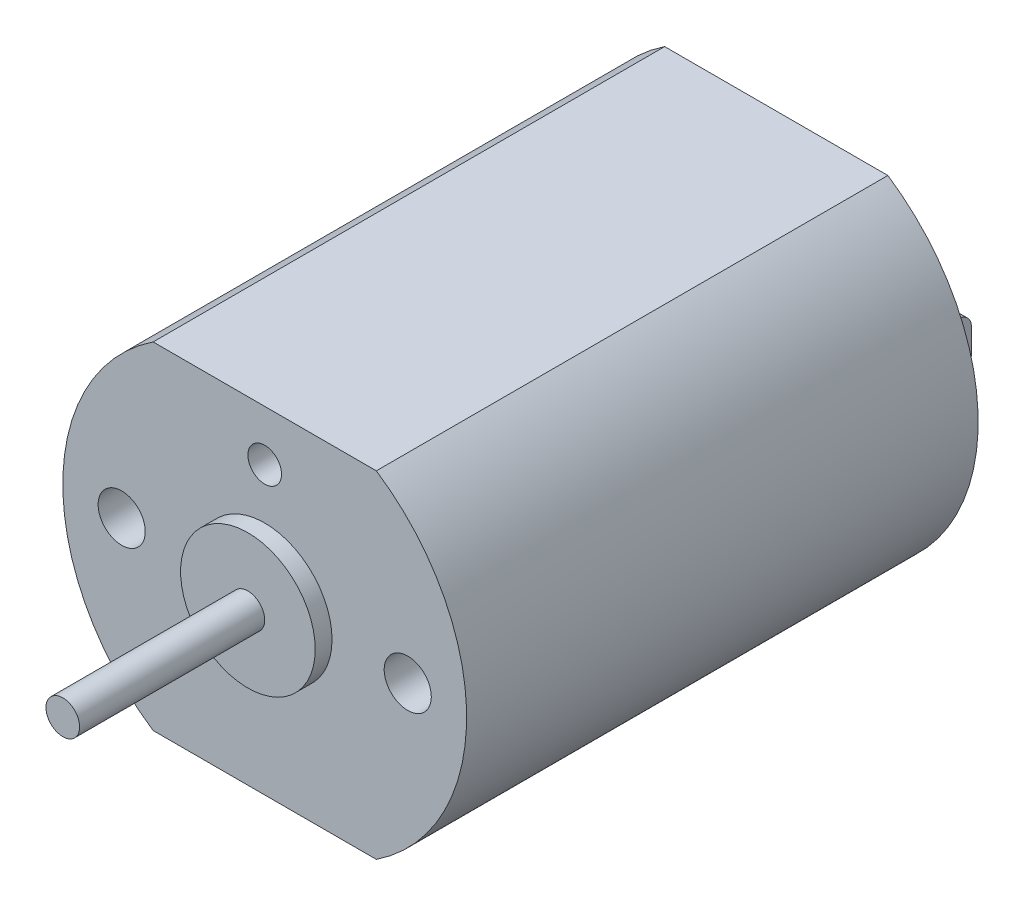
ISO-10303-21;
HEADER;
FILE_DESCRIPTION(('STEP AP214'),'2;1');
FILE_NAME('part.step','',(''),(''),'','','');
FILE_SCHEMA(('AUTOMOTIVE_DESIGN { 1 0 10303 214 1 1 1 1 }'));
ENDSEC;
DATA;
#1=APPLICATION_CONTEXT('core data for automotive mechanical design processes');
#2=APPLICATION_PROTOCOL_DEFINITION('international standard','automotive_design',2000,#1);
#3=PRODUCT_CONTEXT('',#1,'mechanical');
#4=PRODUCT('Part','Part','',(#3));
#5=PRODUCT_RELATED_PRODUCT_CATEGORY('part','',(#4));
#6=PRODUCT_DEFINITION_FORMATION('','',#4);
#7=PRODUCT_DEFINITION_CONTEXT('part definition',#1,'design');
#8=PRODUCT_DEFINITION('design','',#6,#7);
#9=PRODUCT_DEFINITION_SHAPE('','',#8);
#10=(LENGTH_UNIT() NAMED_UNIT(*) SI_UNIT(.MILLI.,.METRE.));
#11=(NAMED_UNIT(*) PLANE_ANGLE_UNIT() SI_UNIT($,.RADIAN.));
#12=(NAMED_UNIT(*) SI_UNIT($,.STERADIAN.) SOLID_ANGLE_UNIT());
#13=UNCERTAINTY_MEASURE_WITH_UNIT(LENGTH_MEASURE(1.E-05),#10,'distance_accuracy_value','');
#14=(GEOMETRIC_REPRESENTATION_CONTEXT(3) GLOBAL_UNCERTAINTY_ASSIGNED_CONTEXT((#13)) GLOBAL_UNIT_ASSIGNED_CONTEXT((#10,
#11,#12)) REPRESENTATION_CONTEXT('',''));
#15=CARTESIAN_POINT('',(0.,0.,0.));
#16=DIRECTION('',(0.,0.,1.));
#17=DIRECTION('',(1.,0.,0.));
#18=AXIS2_PLACEMENT_3D('',#15,#16,#17);
#19=CARTESIAN_POINT('',(0.,5.,15.2));
#20=DIRECTION('',(0.,1.,0.));
#21=DIRECTION('',(0.,0.,1.));
#22=AXIS2_PLACEMENT_3D('',#19,#20,#21);
#23=PLANE('',#22);
#24=DIRECTION('',(1.,0.,0.));
#25=VECTOR('',#24,1.);
#26=CARTESIAN_POINT('',(0.,5.,0.));
#27=LINE('',#26,#25);
#28=CARTESIAN_POINT('',(-3.3166247903554,5.,0.));
#29=VERTEX_POINT('',#28);
#30=CARTESIAN_POINT('',(3.3166247903554,5.,0.));
#31=VERTEX_POINT('',#30);
#32=EDGE_CURVE('E310',#29,#31,#27,.T.);
#33=ORIENTED_EDGE('',*,*,#32,.F.);
#34=DIRECTION('',(0.,0.,-1.));
#35=VECTOR('',#34,1.);
#36=CARTESIAN_POINT('',(-3.3166247903554,5.,15.2));
#37=LINE('',#36,#35);
#38=CARTESIAN_POINT('',(-3.3166247903554,5.,15.2));
#39=VERTEX_POINT('',#38);
#40=EDGE_CURVE('E339',#39,#29,#37,.T.);
#41=ORIENTED_EDGE('',*,*,#40,.F.);
#42=DIRECTION('',(1.,0.,0.));
#43=VECTOR('',#42,1.);
#44=CARTESIAN_POINT('',(0.,5.,15.2));
#45=LINE('',#44,#43);
#46=CARTESIAN_POINT('',(3.3166247903554,5.,15.2));
#47=VERTEX_POINT('',#46);
#48=EDGE_CURVE('E316',#39,#47,#45,.T.);
#49=ORIENTED_EDGE('',*,*,#48,.T.);
#50=DIRECTION('',(0.,0.,-1.));
#51=VECTOR('',#50,1.);
#52=CARTESIAN_POINT('',(3.3166247903554,5.,15.2));
#53=LINE('',#52,#51);
#54=EDGE_CURVE('E331',#47,#31,#53,.T.);
#55=ORIENTED_EDGE('',*,*,#54,.T.);
#56=EDGE_LOOP('',(#33,#41,#49,#55));
#57=FACE_BOUND('',#56,.T.);
#58=ADVANCED_FACE('F38',(#57),#23,.T.);
#59=CARTESIAN_POINT('',(0.,0.,15.2));
#60=DIRECTION('',(0.,0.,-1.));
#61=DIRECTION('',(-1.,0.,0.));
#62=AXIS2_PLACEMENT_3D('',#59,#60,#61);
#63=CYLINDRICAL_SURFACE('',#62,6.);
#64=CARTESIAN_POINT('',(0.,0.,0.));
#65=DIRECTION('',(0.,0.,1.));
#66=DIRECTION('',(1.,0.,0.));
#67=AXIS2_PLACEMENT_3D('',#64,#65,#66);
#68=CIRCLE('',#67,6.);
#69=CARTESIAN_POINT('',(-3.3166247903554,-5.,0.));
#70=VERTEX_POINT('',#69);
#71=EDGE_CURVE('E327',#29,#70,#68,.T.);
#72=ORIENTED_EDGE('',*,*,#71,.T.);
#73=DIRECTION('',(0.,0.,-1.));
#74=VECTOR('',#73,1.);
#75=CARTESIAN_POINT('',(-3.3166247903554,-5.,15.2));
#76=LINE('',#75,#74);
#77=CARTESIAN_POINT('',(-3.3166247903554,-5.,15.2));
#78=VERTEX_POINT('',#77);
#79=EDGE_CURVE('E336',#78,#70,#76,.T.);
#80=ORIENTED_EDGE('',*,*,#79,.F.);
#81=CARTESIAN_POINT('',(0.,0.,15.2));
#82=DIRECTION('',(0.,0.,1.));
#83=DIRECTION('',(1.,0.,0.));
#84=AXIS2_PLACEMENT_3D('',#81,#82,#83);
#85=CIRCLE('',#84,6.);
#86=EDGE_CURVE('E319',#39,#78,#85,.T.);
#87=ORIENTED_EDGE('',*,*,#86,.F.);
#88=ORIENTED_EDGE('',*,*,#40,.T.);
#89=EDGE_LOOP('',(#72,#80,#87,#88));
#90=FACE_BOUND('',#89,.T.);
#91=ADVANCED_FACE('F471',(#90),#63,.T.);
#92=CARTESIAN_POINT('',(0.,-5.,15.2));
#93=DIRECTION('',(0.,1.,0.));
#94=DIRECTION('',(0.,0.,1.));
#95=AXIS2_PLACEMENT_3D('',#92,#93,#94);
#96=PLANE('',#95);
#97=DIRECTION('',(1.,0.,0.));
#98=VECTOR('',#97,1.);
#99=CARTESIAN_POINT('',(0.,-5.,0.));
#100=LINE('',#99,#98);
#101=CARTESIAN_POINT('',(3.3166247903554,-5.,0.));
#102=VERTEX_POINT('',#101);
#103=EDGE_CURVE('E329',#70,#102,#100,.T.);
#104=ORIENTED_EDGE('',*,*,#103,.T.);
#105=DIRECTION('',(0.,0.,-1.));
#106=VECTOR('',#105,1.);
#107=CARTESIAN_POINT('',(3.3166247903554,-5.,15.2));
#108=LINE('',#107,#106);
#109=CARTESIAN_POINT('',(3.3166247903554,-5.,15.2));
#110=VERTEX_POINT('',#109);
#111=EDGE_CURVE('E333',#110,#102,#108,.T.);
#112=ORIENTED_EDGE('',*,*,#111,.F.);
#113=DIRECTION('',(1.,0.,0.));
#114=VECTOR('',#113,1.);
#115=CARTESIAN_POINT('',(0.,-5.,15.2));
#116=LINE('',#115,#114);
#117=EDGE_CURVE('E322',#78,#110,#116,.T.);
#118=ORIENTED_EDGE('',*,*,#117,.F.);
#119=ORIENTED_EDGE('',*,*,#79,.T.);
#120=EDGE_LOOP('',(#104,#112,#118,#119));
#121=FACE_BOUND('',#120,.T.);
#122=ADVANCED_FACE('F476',(#121),#96,.F.);
#123=EDGE_CURVE('E320',#102,#31,#68,.T.);
#124=ORIENTED_EDGE('',*,*,#123,.T.);
#125=ORIENTED_EDGE('',*,*,#54,.F.);
#126=EDGE_CURVE('E323',#110,#47,#85,.T.);
#127=ORIENTED_EDGE('',*,*,#126,.F.);
#128=ORIENTED_EDGE('',*,*,#111,.T.);
#129=EDGE_LOOP('',(#124,#125,#127,#128));
#130=FACE_BOUND('',#129,.T.);
#131=ADVANCED_FACE('F453',(#130),#63,.T.);
#132=CARTESIAN_POINT('',(0.,0.,15.2));
#133=DIRECTION('',(0.,0.,1.));
#134=DIRECTION('',(1.,0.,0.));
#135=AXIS2_PLACEMENT_3D('',#132,#133,#134);
#136=PLANE('',#135);
#137=CARTESIAN_POINT('',(-4.25,0.,15.2));
#138=DIRECTION('',(0.,0.,1.));
#139=DIRECTION('',(1.,0.,0.));
#140=AXIS2_PLACEMENT_3D('',#137,#138,#139);
#141=CIRCLE('',#140,0.7);
#142=CARTESIAN_POINT('',(-3.55,0.,15.2));
#143=VERTEX_POINT('',#142);
#144=EDGE_CURVE('E434',#143,#143,#141,.T.);
#145=ORIENTED_EDGE('',*,*,#144,.F.);
#146=EDGE_LOOP('',(#145));
#147=FACE_BOUND('',#146,.T.);
#148=CARTESIAN_POINT('',(4.25,0.,15.2));
#149=DIRECTION('',(0.,0.,1.));
#150=DIRECTION('',(1.,0.,0.));
#151=AXIS2_PLACEMENT_3D('',#148,#149,#150);
#152=CIRCLE('',#151,0.7);
#153=CARTESIAN_POINT('',(4.95,0.,15.2));
#154=VERTEX_POINT('',#153);
#155=EDGE_CURVE('E428',#154,#154,#152,.T.);
#156=ORIENTED_EDGE('',*,*,#155,.F.);
#157=EDGE_LOOP('',(#156));
#158=FACE_BOUND('',#157,.T.);
#159=CARTESIAN_POINT('',(0.,3.5,15.2));
#160=DIRECTION('',(0.,0.,1.));
#161=DIRECTION('',(1.,0.,0.));
#162=AXIS2_PLACEMENT_3D('',#159,#160,#161);
#163=CIRCLE('',#162,0.5);
#164=CARTESIAN_POINT('',(0.5,3.5,15.2));
#165=VERTEX_POINT('',#164);
#166=EDGE_CURVE('E422',#165,#165,#163,.T.);
#167=ORIENTED_EDGE('',*,*,#166,.F.);
#168=EDGE_LOOP('',(#167));
#169=FACE_BOUND('',#168,.T.);
#170=CARTESIAN_POINT('',(0.,0.,15.2));
#171=DIRECTION('',(0.,0.,1.));
#172=DIRECTION('',(1.,0.,0.));
#173=AXIS2_PLACEMENT_3D('',#170,#171,#172);
#174=CIRCLE('',#173,2.);
#175=CARTESIAN_POINT('',(2.,0.,15.2));
#176=VERTEX_POINT('',#175);
#177=EDGE_CURVE('E11',#176,#176,#174,.T.);
#178=ORIENTED_EDGE('',*,*,#177,.F.);
#179=EDGE_LOOP('',(#178));
#180=FACE_BOUND('',#179,.T.);
#181=ORIENTED_EDGE('',*,*,#48,.F.);
#182=ORIENTED_EDGE('',*,*,#86,.T.);
#183=ORIENTED_EDGE('',*,*,#117,.T.);
#184=ORIENTED_EDGE('',*,*,#126,.T.);
#185=EDGE_LOOP('',(#181,#182,#183,#184));
#186=FACE_BOUND('',#185,.T.);
#187=ADVANCED_FACE('F449',(#147,#158,#169,#180,#186),#136,.T.);
#188=CARTESIAN_POINT('',(0.,0.,0.));
#189=DIRECTION('',(0.,0.,1.));
#190=DIRECTION('',(1.,0.,0.));
#191=AXIS2_PLACEMENT_3D('',#188,#189,#190);
#192=PLANE('',#191);
#193=CARTESIAN_POINT('',(0.,0.,0.));
#194=DIRECTION('',(0.,0.,1.));
#195=DIRECTION('',(1.,0.,0.));
#196=AXIS2_PLACEMENT_3D('',#193,#194,#195);
#197=CIRCLE('',#196,2.5);
#198=CARTESIAN_POINT('',(2.5,0.,0.));
#199=VERTEX_POINT('',#198);
#200=EDGE_CURVE('E405',#199,#199,#197,.T.);
#201=ORIENTED_EDGE('',*,*,#200,.T.);
#202=EDGE_LOOP('',(#201));
#203=FACE_BOUND('',#202,.T.);
#204=DIRECTION('',(0.,1.,0.));
#205=VECTOR('',#204,1.);
#206=CARTESIAN_POINT('',(-3.8,-0.75,0.));
#207=LINE('',#206,#205);
#208=CARTESIAN_POINT('',(-3.8,-0.75,0.));
#209=VERTEX_POINT('',#208);
#210=CARTESIAN_POINT('',(-3.8,0.75,0.));
#211=VERTEX_POINT('',#210);
#212=EDGE_CURVE('E272',#209,#211,#207,.T.);
#213=ORIENTED_EDGE('',*,*,#212,.F.);
#214=DIRECTION('',(1.,0.,0.));
#215=VECTOR('',#214,1.);
#216=CARTESIAN_POINT('',(-3.8,-0.75,0.));
#217=LINE('',#216,#215);
#218=CARTESIAN_POINT('',(-3.5,-0.75,0.));
#219=VERTEX_POINT('',#218);
#220=EDGE_CURVE('E282',#209,#219,#217,.T.);
#221=ORIENTED_EDGE('',*,*,#220,.T.);
#222=DIRECTION('',(0.,1.,0.));
#223=VECTOR('',#222,1.);
#224=CARTESIAN_POINT('',(-3.5,-0.75,0.));
#225=LINE('',#224,#223);
#226=CARTESIAN_POINT('',(-3.5,0.75,0.));
#227=VERTEX_POINT('',#226);
#228=EDGE_CURVE('E279',#219,#227,#225,.T.);
#229=ORIENTED_EDGE('',*,*,#228,.T.);
#230=DIRECTION('',(1.,0.,0.));
#231=VECTOR('',#230,1.);
#232=CARTESIAN_POINT('',(-3.8,0.75,0.));
#233=LINE('',#232,#231);
#234=EDGE_CURVE('E275',#211,#227,#233,.T.);
#235=ORIENTED_EDGE('',*,*,#234,.F.);
#236=EDGE_LOOP('',(#213,#221,#229,#235));
#237=FACE_BOUND('',#236,.T.);
#238=DIRECTION('',(0.,1.,0.));
#239=VECTOR('',#238,1.);
#240=CARTESIAN_POINT('',(3.5,-0.75,0.));
#241=LINE('',#240,#239);
#242=CARTESIAN_POINT('',(3.5,-0.75,0.));
#243=VERTEX_POINT('',#242);
#244=CARTESIAN_POINT('',(3.5,0.75,0.));
#245=VERTEX_POINT('',#244);
#246=EDGE_CURVE('E294',#243,#245,#241,.T.);
#247=ORIENTED_EDGE('',*,*,#246,.F.);
#248=DIRECTION('',(1.,0.,0.));
#249=VECTOR('',#248,1.);
#250=CARTESIAN_POINT('',(3.5,-0.75,0.));
#251=LINE('',#250,#249);
#252=CARTESIAN_POINT('',(3.8,-0.75,0.));
#253=VERTEX_POINT('',#252);
#254=EDGE_CURVE('E285',#243,#253,#251,.T.);
#255=ORIENTED_EDGE('',*,*,#254,.T.);
#256=DIRECTION('',(0.,1.,0.));
#257=VECTOR('',#256,1.);
#258=CARTESIAN_POINT('',(3.8,-0.75,0.));
#259=LINE('',#258,#257);
#260=CARTESIAN_POINT('',(3.8,0.75,0.));
#261=VERTEX_POINT('',#260);
#262=EDGE_CURVE('E300',#253,#261,#259,.T.);
#263=ORIENTED_EDGE('',*,*,#262,.T.);
#264=DIRECTION('',(1.,0.,0.));
#265=VECTOR('',#264,1.);
#266=CARTESIAN_POINT('',(3.5,0.75,0.));
#267=LINE('',#266,#265);
#268=EDGE_CURVE('E303',#245,#261,#267,.T.);
#269=ORIENTED_EDGE('',*,*,#268,.F.);
#270=EDGE_LOOP('',(#247,#255,#263,#269));
#271=FACE_BOUND('',#270,.T.);
#272=ORIENTED_EDGE('',*,*,#32,.T.);
#273=ORIENTED_EDGE('',*,*,#123,.F.);
#274=ORIENTED_EDGE('',*,*,#103,.F.);
#275=ORIENTED_EDGE('',*,*,#71,.F.);
#276=EDGE_LOOP('',(#272,#273,#274,#275));
#277=FACE_BOUND('',#276,.T.);
#278=ADVANCED_FACE('F452',(#203,#237,#271,#277),#192,.F.);
#279=CARTESIAN_POINT('',(3.5,-0.75,-2.));
#280=DIRECTION('',(0.,-1.,0.));
#281=DIRECTION('',(0.,0.,-1.));
#282=AXIS2_PLACEMENT_3D('',#279,#280,#281);
#283=PLANE('',#282);
#284=DIRECTION('',(0.,0.,1.));
#285=VECTOR('',#284,1.);
#286=CARTESIAN_POINT('',(3.5,-0.75,-2.));
#287=LINE('',#286,#285);
#288=CARTESIAN_POINT('',(3.5,-0.75,-1.6));
#289=VERTEX_POINT('',#288);
#290=EDGE_CURVE('E308',#289,#243,#287,.T.);
#291=ORIENTED_EDGE('',*,*,#290,.F.);
#292=DIRECTION('',(1.,0.,0.));
#293=VECTOR('',#292,1.);
#294=CARTESIAN_POINT('',(3.8,-0.75,-1.6));
#295=LINE('',#294,#293);
#296=CARTESIAN_POINT('',(3.8,-0.75,-1.6));
#297=VERTEX_POINT('',#296);
#298=EDGE_CURVE('E381',#289,#297,#295,.T.);
#299=ORIENTED_EDGE('',*,*,#298,.T.);
#300=DIRECTION('',(0.,0.,1.));
#301=VECTOR('',#300,1.);
#302=CARTESIAN_POINT('',(3.8,-0.75,-2.));
#303=LINE('',#302,#301);
#304=EDGE_CURVE('E297',#297,#253,#303,.T.);
#305=ORIENTED_EDGE('',*,*,#304,.T.);
#306=ORIENTED_EDGE('',*,*,#254,.F.);
#307=EDGE_LOOP('',(#291,#299,#305,#306));
#308=FACE_BOUND('',#307,.T.);
#309=ADVANCED_FACE('F481',(#308),#283,.T.);
#310=CARTESIAN_POINT('',(3.5,-0.75,-2.));
#311=DIRECTION('',(1.,0.,0.));
#312=DIRECTION('',(0.,0.,-1.));
#313=AXIS2_PLACEMENT_3D('',#310,#311,#312);
#314=PLANE('',#313);
#315=DIRECTION('',(0.,0.,1.));
#316=VECTOR('',#315,1.);
#317=CARTESIAN_POINT('',(3.5,0.449999999999999,-2.));
#318=LINE('',#317,#316);
#319=CARTESIAN_POINT('',(3.5,0.45,-1.05));
#320=VERTEX_POINT('',#319);
#321=CARTESIAN_POINT('',(3.5,0.45,-0.95));
#322=VERTEX_POINT('',#321);
#323=EDGE_CURVE('E254',#320,#322,#318,.T.);
#324=ORIENTED_EDGE('',*,*,#323,.T.);
#325=CARTESIAN_POINT('',(3.5,0.,-0.95));
#326=DIRECTION('',(1.,0.,0.));
#327=DIRECTION('',(0.,0.,-1.));
#328=AXIS2_PLACEMENT_3D('',#325,#326,#327);
#329=CIRCLE('',#328,0.45);
#330=CARTESIAN_POINT('',(3.5,-0.45,-0.95));
#331=VERTEX_POINT('',#330);
#332=EDGE_CURVE('E260',#322,#331,#329,.T.);
#333=ORIENTED_EDGE('',*,*,#332,.T.);
#334=DIRECTION('',(0.,0.,-1.));
#335=VECTOR('',#334,1.);
#336=CARTESIAN_POINT('',(3.5,-0.45,-2.));
#337=LINE('',#336,#335);
#338=CARTESIAN_POINT('',(3.5,-0.45,-1.05));
#339=VERTEX_POINT('',#338);
#340=EDGE_CURVE('E245',#331,#339,#337,.T.);
#341=ORIENTED_EDGE('',*,*,#340,.T.);
#342=CARTESIAN_POINT('',(3.5,0.,-1.05));
#343=DIRECTION('',(1.,0.,0.));
#344=DIRECTION('',(0.,0.,-1.));
#345=AXIS2_PLACEMENT_3D('',#342,#343,#344);
#346=CIRCLE('',#345,0.45);
#347=EDGE_CURVE('E211',#339,#320,#346,.T.);
#348=ORIENTED_EDGE('',*,*,#347,.T.);
#349=EDGE_LOOP('',(#324,#333,#341,#348));
#350=FACE_BOUND('',#349,.T.);
#351=DIRECTION('',(0.,0.,1.));
#352=VECTOR('',#351,1.);
#353=CARTESIAN_POINT('',(3.5,0.75,-2.));
#354=LINE('',#353,#352);
#355=CARTESIAN_POINT('',(3.5,0.75,-1.6));
#356=VERTEX_POINT('',#355);
#357=EDGE_CURVE('E311',#356,#245,#354,.T.);
#358=ORIENTED_EDGE('',*,*,#357,.F.);
#359=CARTESIAN_POINT('',(3.5,0.35,-1.6));
#360=DIRECTION('',(1.,0.,0.));
#361=DIRECTION('',(0.,0.,-1.));
#362=AXIS2_PLACEMENT_3D('',#359,#360,#361);
#363=CIRCLE('',#362,0.4);
#364=CARTESIAN_POINT('',(3.5,0.35,-2.));
#365=VERTEX_POINT('',#364);
#366=EDGE_CURVE('E379',#356,#365,#363,.F.);
#367=ORIENTED_EDGE('',*,*,#366,.T.);
#368=DIRECTION('',(0.,1.,0.));
#369=VECTOR('',#368,1.);
#370=CARTESIAN_POINT('',(3.5,-0.75,-2.));
#371=LINE('',#370,#369);
#372=CARTESIAN_POINT('',(3.5,-0.35,-2.));
#373=VERTEX_POINT('',#372);
#374=EDGE_CURVE('E293',#373,#365,#371,.T.);
#375=ORIENTED_EDGE('',*,*,#374,.F.);
#376=CARTESIAN_POINT('',(3.5,-0.35,-1.6));
#377=DIRECTION('',(1.,0.,0.));
#378=DIRECTION('',(0.,0.,-1.));
#379=AXIS2_PLACEMENT_3D('',#376,#377,#378);
#380=CIRCLE('',#379,0.4);
#381=EDGE_CURVE('E55',#373,#289,#380,.F.);
#382=ORIENTED_EDGE('',*,*,#381,.T.);
#383=ORIENTED_EDGE('',*,*,#290,.T.);
#384=ORIENTED_EDGE('',*,*,#246,.T.);
#385=EDGE_LOOP('',(#358,#367,#375,#382,#383,#384));
#386=FACE_BOUND('',#385,.T.);
#387=ADVANCED_FACE('F486',(#350,#386),#314,.F.);
#388=CARTESIAN_POINT('',(3.5,0.75,-2.));
#389=DIRECTION('',(0.,-1.,0.));
#390=DIRECTION('',(0.,0.,-1.));
#391=AXIS2_PLACEMENT_3D('',#388,#389,#390);
#392=PLANE('',#391);
#393=DIRECTION('',(0.,0.,1.));
#394=VECTOR('',#393,1.);
#395=CARTESIAN_POINT('',(3.8,0.75,-2.));
#396=LINE('',#395,#394);
#397=CARTESIAN_POINT('',(3.8,0.75,-1.6));
#398=VERTEX_POINT('',#397);
#399=EDGE_CURVE('E313',#398,#261,#396,.T.);
#400=ORIENTED_EDGE('',*,*,#399,.F.);
#401=DIRECTION('',(1.,0.,0.));
#402=VECTOR('',#401,1.);
#403=CARTESIAN_POINT('',(3.5,0.75,-1.6));
#404=LINE('',#403,#402);
#405=EDGE_CURVE('E63',#398,#356,#404,.F.);
#406=ORIENTED_EDGE('',*,*,#405,.T.);
#407=ORIENTED_EDGE('',*,*,#357,.T.);
#408=ORIENTED_EDGE('',*,*,#268,.T.);
#409=EDGE_LOOP('',(#400,#406,#407,#408));
#410=FACE_BOUND('',#409,.T.);
#411=ADVANCED_FACE('F526',(#410),#392,.F.);
#412=CARTESIAN_POINT('',(3.8,-0.75,-2.));
#413=DIRECTION('',(1.,0.,0.));
#414=DIRECTION('',(0.,0.,-1.));
#415=AXIS2_PLACEMENT_3D('',#412,#413,#414);
#416=PLANE('',#415);
#417=CARTESIAN_POINT('',(3.8,0.,-0.95));
#418=DIRECTION('',(1.,0.,0.));
#419=DIRECTION('',(0.,0.,-1.));
#420=AXIS2_PLACEMENT_3D('',#417,#418,#419);
#421=CIRCLE('',#420,0.45);
#422=CARTESIAN_POINT('',(3.8,0.45,-0.95));
#423=VERTEX_POINT('',#422);
#424=CARTESIAN_POINT('',(3.8,-0.45,-0.95));
#425=VERTEX_POINT('',#424);
#426=EDGE_CURVE('E225',#423,#425,#421,.T.);
#427=ORIENTED_EDGE('',*,*,#426,.F.);
#428=DIRECTION('',(0.,0.,1.));
#429=VECTOR('',#428,1.);
#430=CARTESIAN_POINT('',(3.8,0.45,-0.95));
#431=LINE('',#430,#429);
#432=CARTESIAN_POINT('',(3.8,0.45,-1.05));
#433=VERTEX_POINT('',#432);
#434=EDGE_CURVE('E230',#433,#423,#431,.T.);
#435=ORIENTED_EDGE('',*,*,#434,.F.);
#436=CARTESIAN_POINT('',(3.8,0.,-1.05));
#437=DIRECTION('',(1.,0.,0.));
#438=DIRECTION('',(0.,0.,-1.));
#439=AXIS2_PLACEMENT_3D('',#436,#437,#438);
#440=CIRCLE('',#439,0.45);
#441=CARTESIAN_POINT('',(3.8,-0.45,-1.05));
#442=VERTEX_POINT('',#441);
#443=EDGE_CURVE('E208',#442,#433,#440,.T.);
#444=ORIENTED_EDGE('',*,*,#443,.F.);
#445=DIRECTION('',(0.,0.,-1.));
#446=VECTOR('',#445,1.);
#447=CARTESIAN_POINT('',(3.8,-0.45,-0.95));
#448=LINE('',#447,#446);
#449=EDGE_CURVE('E219',#425,#442,#448,.T.);
#450=ORIENTED_EDGE('',*,*,#449,.F.);
#451=EDGE_LOOP('',(#427,#435,#444,#450));
#452=FACE_BOUND('',#451,.T.);
#453=DIRECTION('',(0.,1.,0.));
#454=VECTOR('',#453,1.);
#455=CARTESIAN_POINT('',(3.8,-0.75,-2.));
#456=LINE('',#455,#454);
#457=CARTESIAN_POINT('',(3.8,-0.35,-2.));
#458=VERTEX_POINT('',#457);
#459=CARTESIAN_POINT('',(3.8,0.35,-2.));
#460=VERTEX_POINT('',#459);
#461=EDGE_CURVE('E290',#458,#460,#456,.T.);
#462=ORIENTED_EDGE('',*,*,#461,.T.);
#463=CARTESIAN_POINT('',(3.8,0.35,-1.6));
#464=DIRECTION('',(1.,0.,0.));
#465=DIRECTION('',(0.,0.,-1.));
#466=AXIS2_PLACEMENT_3D('',#463,#464,#465);
#467=CIRCLE('',#466,0.4);
#468=EDGE_CURVE('E375',#460,#398,#467,.T.);
#469=ORIENTED_EDGE('',*,*,#468,.T.);
#470=ORIENTED_EDGE('',*,*,#399,.T.);
#471=ORIENTED_EDGE('',*,*,#262,.F.);
#472=ORIENTED_EDGE('',*,*,#304,.F.);
#473=CARTESIAN_POINT('',(3.8,-0.35,-1.6));
#474=DIRECTION('',(1.,0.,0.));
#475=DIRECTION('',(0.,0.,-1.));
#476=AXIS2_PLACEMENT_3D('',#473,#474,#475);
#477=CIRCLE('',#476,0.4);
#478=EDGE_CURVE('E373',#297,#458,#477,.T.);
#479=ORIENTED_EDGE('',*,*,#478,.T.);
#480=EDGE_LOOP('',(#462,#469,#470,#471,#472,#479));
#481=FACE_BOUND('',#480,.T.);
#482=ADVANCED_FACE('F227',(#452,#481),#416,.T.);
#483=CARTESIAN_POINT('',(0.,0.,-2.));
#484=DIRECTION('',(0.,0.,1.));
#485=DIRECTION('',(1.,0.,0.));
#486=AXIS2_PLACEMENT_3D('',#483,#484,#485);
#487=PLANE('',#486);
#488=ORIENTED_EDGE('',*,*,#374,.T.);
#489=DIRECTION('',(1.,0.,0.));
#490=VECTOR('',#489,1.);
#491=CARTESIAN_POINT('',(0.,0.35,-2.));
#492=LINE('',#491,#490);
#493=EDGE_CURVE('E370',#365,#460,#492,.T.);
#494=ORIENTED_EDGE('',*,*,#493,.T.);
#495=ORIENTED_EDGE('',*,*,#461,.F.);
#496=DIRECTION('',(1.,0.,0.));
#497=VECTOR('',#496,1.);
#498=CARTESIAN_POINT('',(3.5,-0.35,-2.));
#499=LINE('',#498,#497);
#500=EDGE_CURVE('E368',#458,#373,#499,.F.);
#501=ORIENTED_EDGE('',*,*,#500,.T.);
#502=EDGE_LOOP('',(#488,#494,#495,#501));
#503=FACE_BOUND('',#502,.T.);
#504=ADVANCED_FACE('F525',(#503),#487,.F.);
#505=CARTESIAN_POINT('',(-3.8,-0.75,-2.));
#506=DIRECTION('',(0.,-1.,0.));
#507=DIRECTION('',(0.,0.,-1.));
#508=AXIS2_PLACEMENT_3D('',#505,#506,#507);
#509=PLANE('',#508);
#510=DIRECTION('',(0.,0.,1.));
#511=VECTOR('',#510,1.);
#512=CARTESIAN_POINT('',(-3.8,-0.75,-2.));
#513=LINE('',#512,#511);
#514=CARTESIAN_POINT('',(-3.8,-0.75,-1.6));
#515=VERTEX_POINT('',#514);
#516=EDGE_CURVE('E263',#515,#209,#513,.T.);
#517=ORIENTED_EDGE('',*,*,#516,.F.);
#518=DIRECTION('',(1.,0.,0.));
#519=VECTOR('',#518,1.);
#520=CARTESIAN_POINT('',(-3.5,-0.75,-1.6));
#521=LINE('',#520,#519);
#522=CARTESIAN_POINT('',(-3.5,-0.75,-1.6));
#523=VERTEX_POINT('',#522);
#524=EDGE_CURVE('E365',#515,#523,#521,.T.);
#525=ORIENTED_EDGE('',*,*,#524,.T.);
#526=DIRECTION('',(0.,0.,1.));
#527=VECTOR('',#526,1.);
#528=CARTESIAN_POINT('',(-3.5,-0.75,-2.));
#529=LINE('',#528,#527);
#530=EDGE_CURVE('E264',#523,#219,#529,.T.);
#531=ORIENTED_EDGE('',*,*,#530,.T.);
#532=ORIENTED_EDGE('',*,*,#220,.F.);
#533=EDGE_LOOP('',(#517,#525,#531,#532));
#534=FACE_BOUND('',#533,.T.);
#535=ADVANCED_FACE('F539',(#534),#509,.T.);
#536=CARTESIAN_POINT('',(-3.8,-0.75,-2.));
#537=DIRECTION('',(1.,0.,0.));
#538=DIRECTION('',(0.,0.,-1.));
#539=AXIS2_PLACEMENT_3D('',#536,#537,#538);
#540=PLANE('',#539);
#541=DIRECTION('',(0.,0.,1.));
#542=VECTOR('',#541,1.);
#543=CARTESIAN_POINT('',(-3.8,0.449999999999999,-2.));
#544=LINE('',#543,#542);
#545=CARTESIAN_POINT('',(-3.8,0.45,-1.05));
#546=VERTEX_POINT('',#545);
#547=CARTESIAN_POINT('',(-3.8,0.45,-0.95));
#548=VERTEX_POINT('',#547);
#549=EDGE_CURVE('E251',#546,#548,#544,.T.);
#550=ORIENTED_EDGE('',*,*,#549,.T.);
#551=CARTESIAN_POINT('',(-3.8,0.,-0.95));
#552=DIRECTION('',(1.,0.,0.));
#553=DIRECTION('',(0.,0.,-1.));
#554=AXIS2_PLACEMENT_3D('',#551,#552,#553);
#555=CIRCLE('',#554,0.45);
#556=CARTESIAN_POINT('',(-3.8,-0.45,-0.95));
#557=VERTEX_POINT('',#556);
#558=EDGE_CURVE('E257',#548,#557,#555,.T.);
#559=ORIENTED_EDGE('',*,*,#558,.T.);
#560=DIRECTION('',(0.,0.,-1.));
#561=VECTOR('',#560,1.);
#562=CARTESIAN_POINT('',(-3.8,-0.45,-2.));
#563=LINE('',#562,#561);
#564=CARTESIAN_POINT('',(-3.8,-0.45,-1.05));
#565=VERTEX_POINT('',#564);
#566=EDGE_CURVE('E242',#557,#565,#563,.T.);
#567=ORIENTED_EDGE('',*,*,#566,.T.);
#568=CARTESIAN_POINT('',(-3.8,0.,-1.05));
#569=DIRECTION('',(1.,0.,0.));
#570=DIRECTION('',(0.,0.,-1.));
#571=AXIS2_PLACEMENT_3D('',#568,#569,#570);
#572=CIRCLE('',#571,0.45);
#573=EDGE_CURVE('E247',#565,#546,#572,.T.);
#574=ORIENTED_EDGE('',*,*,#573,.T.);
#575=EDGE_LOOP('',(#550,#559,#567,#574));
#576=FACE_BOUND('',#575,.T.);
#577=DIRECTION('',(0.,0.,1.));
#578=VECTOR('',#577,1.);
#579=CARTESIAN_POINT('',(-3.8,0.75,-2.));
#580=LINE('',#579,#578);
#581=CARTESIAN_POINT('',(-3.8,0.75,-1.6));
#582=VERTEX_POINT('',#581);
#583=EDGE_CURVE('E269',#582,#211,#580,.T.);
#584=ORIENTED_EDGE('',*,*,#583,.F.);
#585=CARTESIAN_POINT('',(-3.8,0.35,-1.6));
#586=DIRECTION('',(1.,0.,0.));
#587=DIRECTION('',(0.,0.,-1.));
#588=AXIS2_PLACEMENT_3D('',#585,#586,#587);
#589=CIRCLE('',#588,0.4);
#590=CARTESIAN_POINT('',(-3.8,0.35,-2.));
#591=VERTEX_POINT('',#590);
#592=EDGE_CURVE('E363',#582,#591,#589,.F.);
#593=ORIENTED_EDGE('',*,*,#592,.T.);
#594=DIRECTION('',(0.,1.,0.));
#595=VECTOR('',#594,1.);
#596=CARTESIAN_POINT('',(-3.8,-0.75,-2.));
#597=LINE('',#596,#595);
#598=CARTESIAN_POINT('',(-3.8,-0.35,-2.));
#599=VERTEX_POINT('',#598);
#600=EDGE_CURVE('E266',#599,#591,#597,.T.);
#601=ORIENTED_EDGE('',*,*,#600,.F.);
#602=CARTESIAN_POINT('',(-3.8,-0.35,-1.6));
#603=DIRECTION('',(1.,0.,0.));
#604=DIRECTION('',(0.,0.,-1.));
#605=AXIS2_PLACEMENT_3D('',#602,#603,#604);
#606=CIRCLE('',#605,0.4);
#607=EDGE_CURVE('E361',#599,#515,#606,.F.);
#608=ORIENTED_EDGE('',*,*,#607,.T.);
#609=ORIENTED_EDGE('',*,*,#516,.T.);
#610=ORIENTED_EDGE('',*,*,#212,.T.);
#611=EDGE_LOOP('',(#584,#593,#601,#608,#609,#610));
#612=FACE_BOUND('',#611,.T.);
#613=ADVANCED_FACE('F546',(#576,#612),#540,.F.);
#614=CARTESIAN_POINT('',(-3.8,0.75,-2.));
#615=DIRECTION('',(0.,-1.,0.));
#616=DIRECTION('',(0.,0.,-1.));
#617=AXIS2_PLACEMENT_3D('',#614,#615,#616);
#618=PLANE('',#617);
#619=DIRECTION('',(0.,0.,1.));
#620=VECTOR('',#619,1.);
#621=CARTESIAN_POINT('',(-3.5,0.75,-2.));
#622=LINE('',#621,#620);
#623=CARTESIAN_POINT('',(-3.5,0.75,-1.6));
#624=VERTEX_POINT('',#623);
#625=EDGE_CURVE('E267',#624,#227,#622,.T.);
#626=ORIENTED_EDGE('',*,*,#625,.F.);
#627=DIRECTION('',(1.,0.,0.));
#628=VECTOR('',#627,1.);
#629=CARTESIAN_POINT('',(-3.8,0.75,-1.6));
#630=LINE('',#629,#628);
#631=EDGE_CURVE('E359',#624,#582,#630,.F.);
#632=ORIENTED_EDGE('',*,*,#631,.T.);
#633=ORIENTED_EDGE('',*,*,#583,.T.);
#634=ORIENTED_EDGE('',*,*,#234,.T.);
#635=EDGE_LOOP('',(#626,#632,#633,#634));
#636=FACE_BOUND('',#635,.T.);
#637=ADVANCED_FACE('F549',(#636),#618,.F.);
#638=CARTESIAN_POINT('',(-3.5,-0.75,-2.));
#639=DIRECTION('',(1.,0.,0.));
#640=DIRECTION('',(0.,0.,-1.));
#641=AXIS2_PLACEMENT_3D('',#638,#639,#640);
#642=PLANE('',#641);
#643=CARTESIAN_POINT('',(-3.5,0.,-0.95));
#644=DIRECTION('',(1.,0.,0.));
#645=DIRECTION('',(0.,0.,-1.));
#646=AXIS2_PLACEMENT_3D('',#643,#644,#645);
#647=CIRCLE('',#646,0.45);
#648=CARTESIAN_POINT('',(-3.5,0.45,-0.95));
#649=VERTEX_POINT('',#648);
#650=CARTESIAN_POINT('',(-3.5,-0.45,-0.95));
#651=VERTEX_POINT('',#650);
#652=EDGE_CURVE('E347',#649,#651,#647,.T.);
#653=ORIENTED_EDGE('',*,*,#652,.F.);
#654=DIRECTION('',(0.,0.,1.));
#655=VECTOR('',#654,1.);
#656=CARTESIAN_POINT('',(-3.5,0.449999999999999,-2.));
#657=LINE('',#656,#655);
#658=CARTESIAN_POINT('',(-3.5,0.45,-1.05));
#659=VERTEX_POINT('',#658);
#660=EDGE_CURVE('E345',#659,#649,#657,.T.);
#661=ORIENTED_EDGE('',*,*,#660,.F.);
#662=CARTESIAN_POINT('',(-3.5,0.,-1.05));
#663=DIRECTION('',(1.,0.,0.));
#664=DIRECTION('',(0.,0.,-1.));
#665=AXIS2_PLACEMENT_3D('',#662,#663,#664);
#666=CIRCLE('',#665,0.45);
#667=CARTESIAN_POINT('',(-3.5,-0.45,-1.05));
#668=VERTEX_POINT('',#667);
#669=EDGE_CURVE('E343',#668,#659,#666,.T.);
#670=ORIENTED_EDGE('',*,*,#669,.F.);
#671=DIRECTION('',(0.,0.,-1.));
#672=VECTOR('',#671,1.);
#673=CARTESIAN_POINT('',(-3.5,-0.45,-2.));
#674=LINE('',#673,#672);
#675=EDGE_CURVE('E341',#651,#668,#674,.T.);
#676=ORIENTED_EDGE('',*,*,#675,.F.);
#677=EDGE_LOOP('',(#653,#661,#670,#676));
#678=FACE_BOUND('',#677,.T.);
#679=DIRECTION('',(0.,1.,0.));
#680=VECTOR('',#679,1.);
#681=CARTESIAN_POINT('',(-3.5,-0.75,-2.));
#682=LINE('',#681,#680);
#683=CARTESIAN_POINT('',(-3.5,-0.35,-2.));
#684=VERTEX_POINT('',#683);
#685=CARTESIAN_POINT('',(-3.5,0.35,-2.));
#686=VERTEX_POINT('',#685);
#687=EDGE_CURVE('E276',#684,#686,#682,.T.);
#688=ORIENTED_EDGE('',*,*,#687,.T.);
#689=CARTESIAN_POINT('',(-3.5,0.35,-1.6));
#690=DIRECTION('',(1.,0.,0.));
#691=DIRECTION('',(0.,0.,-1.));
#692=AXIS2_PLACEMENT_3D('',#689,#690,#691);
#693=CIRCLE('',#692,0.4);
#694=EDGE_CURVE('E357',#686,#624,#693,.T.);
#695=ORIENTED_EDGE('',*,*,#694,.T.);
#696=ORIENTED_EDGE('',*,*,#625,.T.);
#697=ORIENTED_EDGE('',*,*,#228,.F.);
#698=ORIENTED_EDGE('',*,*,#530,.F.);
#699=CARTESIAN_POINT('',(-3.5,-0.35,-1.6));
#700=DIRECTION('',(1.,0.,0.));
#701=DIRECTION('',(0.,0.,-1.));
#702=AXIS2_PLACEMENT_3D('',#699,#700,#701);
#703=CIRCLE('',#702,0.4);
#704=EDGE_CURVE('E355',#523,#684,#703,.T.);
#705=ORIENTED_EDGE('',*,*,#704,.T.);
#706=EDGE_LOOP('',(#688,#695,#696,#697,#698,#705));
#707=FACE_BOUND('',#706,.T.);
#708=ADVANCED_FACE('F544',(#678,#707),#642,.T.);
#709=CARTESIAN_POINT('',(0.,0.,-2.));
#710=DIRECTION('',(0.,0.,1.));
#711=DIRECTION('',(1.,0.,0.));
#712=AXIS2_PLACEMENT_3D('',#709,#710,#711);
#713=PLANE('',#712);
#714=ORIENTED_EDGE('',*,*,#600,.T.);
#715=DIRECTION('',(1.,0.,0.));
#716=VECTOR('',#715,1.);
#717=CARTESIAN_POINT('',(0.,0.35,-2.));
#718=LINE('',#717,#716);
#719=EDGE_CURVE('E352',#591,#686,#718,.T.);
#720=ORIENTED_EDGE('',*,*,#719,.T.);
#721=ORIENTED_EDGE('',*,*,#687,.F.);
#722=DIRECTION('',(1.,0.,0.));
#723=VECTOR('',#722,1.);
#724=CARTESIAN_POINT('',(-3.8,-0.35,-2.));
#725=LINE('',#724,#723);
#726=EDGE_CURVE('E350',#684,#599,#725,.F.);
#727=ORIENTED_EDGE('',*,*,#726,.T.);
#728=EDGE_LOOP('',(#714,#720,#721,#727));
#729=FACE_BOUND('',#728,.T.);
#730=ADVANCED_FACE('F540',(#729),#713,.F.);
#731=CARTESIAN_POINT('',(-6.,-0.45,-0.95));
#732=DIRECTION('',(0.,-1.,0.));
#733=DIRECTION('',(0.,0.,-1.));
#734=AXIS2_PLACEMENT_3D('',#731,#732,#733);
#735=PLANE('',#734);
#736=DIRECTION('',(1.,0.,0.));
#737=VECTOR('',#736,1.);
#738=CARTESIAN_POINT('',(-6.,-0.45,-0.95));
#739=LINE('',#738,#737);
#740=EDGE_CURVE('E215',#557,#651,#739,.T.);
#741=ORIENTED_EDGE('',*,*,#740,.T.);
#742=ORIENTED_EDGE('',*,*,#675,.T.);
#743=DIRECTION('',(1.,0.,0.));
#744=VECTOR('',#743,1.);
#745=CARTESIAN_POINT('',(-6.,-0.45,-1.05));
#746=LINE('',#745,#744);
#747=EDGE_CURVE('E214',#565,#668,#746,.T.);
#748=ORIENTED_EDGE('',*,*,#747,.F.);
#749=ORIENTED_EDGE('',*,*,#566,.F.);
#750=EDGE_LOOP('',(#741,#742,#748,#749));
#751=FACE_BOUND('',#750,.T.);
#752=ADVANCED_FACE('F543',(#751),#735,.F.);
#753=CARTESIAN_POINT('',(-6.,0.,-1.05));
#754=DIRECTION('',(1.,0.,0.));
#755=DIRECTION('',(0.,0.,-1.));
#756=AXIS2_PLACEMENT_3D('',#753,#754,#755);
#757=CYLINDRICAL_SURFACE('',#756,0.45);
#758=ORIENTED_EDGE('',*,*,#747,.T.);
#759=ORIENTED_EDGE('',*,*,#669,.T.);
#760=DIRECTION('',(1.,0.,0.));
#761=VECTOR('',#760,1.);
#762=CARTESIAN_POINT('',(-6.,0.45,-1.05));
#763=LINE('',#762,#761);
#764=EDGE_CURVE('E238',#546,#659,#763,.T.);
#765=ORIENTED_EDGE('',*,*,#764,.F.);
#766=ORIENTED_EDGE('',*,*,#573,.F.);
#767=EDGE_LOOP('',(#758,#759,#765,#766));
#768=FACE_BOUND('',#767,.T.);
#769=ADVANCED_FACE('F570',(#768),#757,.F.);
#770=CARTESIAN_POINT('',(-6.,0.45,-0.95));
#771=DIRECTION('',(0.,1.,0.));
#772=DIRECTION('',(0.,0.,1.));
#773=AXIS2_PLACEMENT_3D('',#770,#771,#772);
#774=PLANE('',#773);
#775=ORIENTED_EDGE('',*,*,#764,.T.);
#776=ORIENTED_EDGE('',*,*,#660,.T.);
#777=DIRECTION('',(1.,0.,0.));
#778=VECTOR('',#777,1.);
#779=CARTESIAN_POINT('',(-6.,0.45,-0.95));
#780=LINE('',#779,#778);
#781=EDGE_CURVE('E237',#548,#649,#780,.T.);
#782=ORIENTED_EDGE('',*,*,#781,.F.);
#783=ORIENTED_EDGE('',*,*,#549,.F.);
#784=EDGE_LOOP('',(#775,#776,#782,#783));
#785=FACE_BOUND('',#784,.T.);
#786=ADVANCED_FACE('F573',(#785),#774,.F.);
#787=CARTESIAN_POINT('',(-6.,0.,-0.95));
#788=DIRECTION('',(1.,0.,0.));
#789=DIRECTION('',(0.,0.,-1.));
#790=AXIS2_PLACEMENT_3D('',#787,#788,#789);
#791=CYLINDRICAL_SURFACE('',#790,0.45);
#792=ORIENTED_EDGE('',*,*,#781,.T.);
#793=ORIENTED_EDGE('',*,*,#652,.T.);
#794=ORIENTED_EDGE('',*,*,#740,.F.);
#795=ORIENTED_EDGE('',*,*,#558,.F.);
#796=EDGE_LOOP('',(#792,#793,#794,#795));
#797=FACE_BOUND('',#796,.T.);
#798=ADVANCED_FACE('F564',(#797),#791,.F.);
#799=EDGE_CURVE('E235',#322,#423,#780,.T.);
#800=ORIENTED_EDGE('',*,*,#799,.T.);
#801=ORIENTED_EDGE('',*,*,#426,.T.);
#802=EDGE_CURVE('E222',#331,#425,#739,.T.);
#803=ORIENTED_EDGE('',*,*,#802,.F.);
#804=ORIENTED_EDGE('',*,*,#332,.F.);
#805=EDGE_LOOP('',(#800,#801,#803,#804));
#806=FACE_BOUND('',#805,.T.);
#807=ADVANCED_FACE('F560',(#806),#791,.F.);
#808=EDGE_CURVE('E239',#320,#433,#763,.T.);
#809=ORIENTED_EDGE('',*,*,#808,.T.);
#810=ORIENTED_EDGE('',*,*,#434,.T.);
#811=ORIENTED_EDGE('',*,*,#799,.F.);
#812=ORIENTED_EDGE('',*,*,#323,.F.);
#813=EDGE_LOOP('',(#809,#810,#811,#812));
#814=FACE_BOUND('',#813,.T.);
#815=ADVANCED_FACE('F563',(#814),#774,.F.);
#816=EDGE_CURVE('E203',#339,#442,#746,.T.);
#817=ORIENTED_EDGE('',*,*,#816,.T.);
#818=ORIENTED_EDGE('',*,*,#443,.T.);
#819=ORIENTED_EDGE('',*,*,#808,.F.);
#820=ORIENTED_EDGE('',*,*,#347,.F.);
#821=EDGE_LOOP('',(#817,#818,#819,#820));
#822=FACE_BOUND('',#821,.T.);
#823=ADVANCED_FACE('F205',(#822),#757,.F.);
#824=ORIENTED_EDGE('',*,*,#802,.T.);
#825=ORIENTED_EDGE('',*,*,#449,.T.);
#826=ORIENTED_EDGE('',*,*,#816,.F.);
#827=ORIENTED_EDGE('',*,*,#340,.F.);
#828=EDGE_LOOP('',(#824,#825,#826,#827));
#829=FACE_BOUND('',#828,.T.);
#830=ADVANCED_FACE('F220',(#829),#735,.F.);
#831=CARTESIAN_POINT('',(0.,0.35,-1.6));
#832=DIRECTION('',(1.,0.,0.));
#833=DIRECTION('',(0.,0.,-1.));
#834=AXIS2_PLACEMENT_3D('',#831,#832,#833);
#835=CYLINDRICAL_SURFACE('',#834,0.4);
#836=ORIENTED_EDGE('',*,*,#592,.F.);
#837=ORIENTED_EDGE('',*,*,#631,.F.);
#838=ORIENTED_EDGE('',*,*,#694,.F.);
#839=ORIENTED_EDGE('',*,*,#719,.F.);
#840=EDGE_LOOP('',(#836,#837,#838,#839));
#841=FACE_BOUND('',#840,.T.);
#842=ADVANCED_FACE('F498',(#841),#835,.T.);
#843=CARTESIAN_POINT('',(-3.8,-0.35,-1.6));
#844=DIRECTION('',(-1.,0.,0.));
#845=DIRECTION('',(0.,0.,1.));
#846=AXIS2_PLACEMENT_3D('',#843,#844,#845);
#847=CYLINDRICAL_SURFACE('',#846,0.4);
#848=ORIENTED_EDGE('',*,*,#607,.F.);
#849=ORIENTED_EDGE('',*,*,#726,.F.);
#850=ORIENTED_EDGE('',*,*,#704,.F.);
#851=ORIENTED_EDGE('',*,*,#524,.F.);
#852=EDGE_LOOP('',(#848,#849,#850,#851));
#853=FACE_BOUND('',#852,.T.);
#854=ADVANCED_FACE('F501',(#853),#847,.T.);
#855=CARTESIAN_POINT('',(0.,0.35,-1.6));
#856=DIRECTION('',(1.,0.,0.));
#857=DIRECTION('',(0.,0.,-1.));
#858=AXIS2_PLACEMENT_3D('',#855,#856,#857);
#859=CYLINDRICAL_SURFACE('',#858,0.4);
#860=ORIENTED_EDGE('',*,*,#366,.F.);
#861=ORIENTED_EDGE('',*,*,#405,.F.);
#862=ORIENTED_EDGE('',*,*,#468,.F.);
#863=ORIENTED_EDGE('',*,*,#493,.F.);
#864=EDGE_LOOP('',(#860,#861,#862,#863));
#865=FACE_BOUND('',#864,.T.);
#866=ADVANCED_FACE('F505',(#865),#859,.T.);
#867=CARTESIAN_POINT('',(3.5,-0.35,-1.6));
#868=DIRECTION('',(-1.,0.,0.));
#869=DIRECTION('',(0.,0.,1.));
#870=AXIS2_PLACEMENT_3D('',#867,#868,#869);
#871=CYLINDRICAL_SURFACE('',#870,0.4);
#872=ORIENTED_EDGE('',*,*,#381,.F.);
#873=ORIENTED_EDGE('',*,*,#500,.F.);
#874=ORIENTED_EDGE('',*,*,#478,.F.);
#875=ORIENTED_EDGE('',*,*,#298,.F.);
#876=EDGE_LOOP('',(#872,#873,#874,#875));
#877=FACE_BOUND('',#876,.T.);
#878=ADVANCED_FACE('F401',(#877),#871,.T.);
#879=CARTESIAN_POINT('',(0.,0.,-1.2));
#880=DIRECTION('',(0.,0.,1.));
#881=DIRECTION('',(1.,0.,0.));
#882=AXIS2_PLACEMENT_3D('',#879,#880,#881);
#883=CYLINDRICAL_SURFACE('',#882,2.5);
#884=CARTESIAN_POINT('',(0.,0.,-0.8));
#885=DIRECTION('',(0.,0.,1.));
#886=DIRECTION('',(1.,0.,0.));
#887=AXIS2_PLACEMENT_3D('',#884,#885,#886);
#888=CIRCLE('',#887,2.5);
#889=CARTESIAN_POINT('',(2.5,0.,-0.8));
#890=VERTEX_POINT('',#889);
#891=EDGE_CURVE('E384',#890,#890,#888,.T.);
#892=ORIENTED_EDGE('',*,*,#891,.T.);
#893=EDGE_LOOP('',(#892));
#894=FACE_BOUND('',#893,.T.);
#895=ORIENTED_EDGE('',*,*,#200,.F.);
#896=EDGE_LOOP('',(#895));
#897=FACE_BOUND('',#896,.T.);
#898=ADVANCED_FACE('F398',(#894,#897),#883,.T.);
#899=CARTESIAN_POINT('',(0.,0.,-1.2));
#900=DIRECTION('',(0.,0.,1.));
#901=DIRECTION('',(1.,0.,0.));
#902=AXIS2_PLACEMENT_3D('',#899,#900,#901);
#903=PLANE('',#902);
#904=CARTESIAN_POINT('',(0.,0.,-1.2));
#905=DIRECTION('',(0.,0.,1.));
#906=DIRECTION('',(1.,0.,0.));
#907=AXIS2_PLACEMENT_3D('',#904,#905,#906);
#908=CIRCLE('',#907,2.1);
#909=CARTESIAN_POINT('',(2.1,0.,-1.2));
#910=VERTEX_POINT('',#909);
#911=EDGE_CURVE('E47',#910,#910,#908,.F.);
#912=ORIENTED_EDGE('',*,*,#911,.T.);
#913=EDGE_LOOP('',(#912));
#914=FACE_BOUND('',#913,.T.);
#915=CARTESIAN_POINT('',(0.,0.,-1.2));
#916=DIRECTION('',(0.,0.,1.));
#917=DIRECTION('',(1.,0.,0.));
#918=AXIS2_PLACEMENT_3D('',#915,#916,#917);
#919=CIRCLE('',#918,1.5);
#920=CARTESIAN_POINT('',(1.5,0.,-1.2));
#921=VERTEX_POINT('',#920);
#922=EDGE_CURVE('E410',#921,#921,#919,.T.);
#923=ORIENTED_EDGE('',*,*,#922,.T.);
#924=EDGE_LOOP('',(#923));
#925=FACE_BOUND('',#924,.T.);
#926=ADVANCED_FACE('F389',(#914,#925),#903,.F.);
#927=CARTESIAN_POINT('',(0.,0.,-0.6));
#928=DIRECTION('',(0.,0.,-1.));
#929=DIRECTION('',(-1.,0.,0.));
#930=AXIS2_PLACEMENT_3D('',#927,#928,#929);
#931=CYLINDRICAL_SURFACE('',#930,1.5);
#932=CARTESIAN_POINT('',(0.,0.,-0.6));
#933=DIRECTION('',(0.,0.,1.));
#934=DIRECTION('',(1.,0.,0.));
#935=AXIS2_PLACEMENT_3D('',#932,#933,#934);
#936=CIRCLE('',#935,1.5);
#937=CARTESIAN_POINT('',(1.5,0.,-0.6));
#938=VERTEX_POINT('',#937);
#939=EDGE_CURVE('E407',#938,#938,#936,.T.);
#940=ORIENTED_EDGE('',*,*,#939,.T.);
#941=EDGE_LOOP('',(#940));
#942=FACE_BOUND('',#941,.T.);
#943=ORIENTED_EDGE('',*,*,#922,.F.);
#944=EDGE_LOOP('',(#943));
#945=FACE_BOUND('',#944,.T.);
#946=ADVANCED_FACE('F577',(#942,#945),#931,.F.);
#947=CARTESIAN_POINT('',(0.,0.,-0.6));
#948=DIRECTION('',(0.,0.,1.));
#949=DIRECTION('',(1.,0.,0.));
#950=AXIS2_PLACEMENT_3D('',#947,#948,#949);
#951=PLANE('',#950);
#952=ORIENTED_EDGE('',*,*,#939,.F.);
#953=EDGE_LOOP('',(#952));
#954=FACE_BOUND('',#953,.T.);
#955=ADVANCED_FACE('F395',(#954),#951,.F.);
#956=CARTESIAN_POINT('',(0.,0.,-0.8));
#957=DIRECTION('',(0.,0.,1.));
#958=DIRECTION('',(1.,0.,0.));
#959=AXIS2_PLACEMENT_3D('',#956,#957,#958);
#960=TOROIDAL_SURFACE('',#959,2.1,0.4);
#961=ORIENTED_EDGE('',*,*,#911,.F.);
#962=EDGE_LOOP('',(#961));
#963=FACE_BOUND('',#962,.T.);
#964=ORIENTED_EDGE('',*,*,#891,.F.);
#965=EDGE_LOOP('',(#964));
#966=FACE_BOUND('',#965,.T.);
#967=ADVANCED_FACE('F40',(#963,#966),#960,.T.);
#968=CARTESIAN_POINT('',(0.,0.,15.7));
#969=DIRECTION('',(0.,0.,-1.));
#970=DIRECTION('',(-1.,0.,0.));
#971=AXIS2_PLACEMENT_3D('',#968,#969,#970);
#972=CYLINDRICAL_SURFACE('',#971,2.);
#973=CARTESIAN_POINT('',(0.,0.,15.7));
#974=DIRECTION('',(0.,0.,1.));
#975=DIRECTION('',(1.,0.,0.));
#976=AXIS2_PLACEMENT_3D('',#973,#974,#975);
#977=CIRCLE('',#976,2.);
#978=CARTESIAN_POINT('',(2.,0.,15.7));
#979=VERTEX_POINT('',#978);
#980=EDGE_CURVE('E414',#979,#979,#977,.T.);
#981=ORIENTED_EDGE('',*,*,#980,.F.);
#982=EDGE_LOOP('',(#981));
#983=FACE_BOUND('',#982,.T.);
#984=ORIENTED_EDGE('',*,*,#177,.T.);
#985=EDGE_LOOP('',(#984));
#986=FACE_BOUND('',#985,.T.);
#987=ADVANCED_FACE('F394',(#983,#986),#972,.T.);
#988=CARTESIAN_POINT('',(0.,0.,15.7));
#989=DIRECTION('',(0.,0.,1.));
#990=DIRECTION('',(1.,0.,0.));
#991=AXIS2_PLACEMENT_3D('',#988,#989,#990);
#992=PLANE('',#991);
#993=CARTESIAN_POINT('',(0.,0.,15.7));
#994=DIRECTION('',(0.,0.,1.));
#995=DIRECTION('',(1.,0.,0.));
#996=AXIS2_PLACEMENT_3D('',#993,#994,#995);
#997=CIRCLE('',#996,0.5);
#998=CARTESIAN_POINT('',(0.5,0.,15.7));
#999=VERTEX_POINT('',#998);
#1000=EDGE_CURVE('E42',#999,#999,#997,.F.);
#1001=ORIENTED_EDGE('',*,*,#1000,.T.);
#1002=EDGE_LOOP('',(#1001));
#1003=FACE_BOUND('',#1002,.T.);
#1004=ORIENTED_EDGE('',*,*,#980,.T.);
#1005=EDGE_LOOP('',(#1004));
#1006=FACE_BOUND('',#1005,.T.);
#1007=ADVANCED_FACE('F586',(#1003,#1006),#992,.T.);
#1008=CARTESIAN_POINT('',(0.,0.,21.2));
#1009=DIRECTION('',(0.,0.,-1.));
#1010=DIRECTION('',(-1.,0.,0.));
#1011=AXIS2_PLACEMENT_3D('',#1008,#1009,#1010);
#1012=CYLINDRICAL_SURFACE('',#1011,0.5);
#1013=ORIENTED_EDGE('',*,*,#1000,.F.);
#1014=EDGE_LOOP('',(#1013));
#1015=FACE_BOUND('',#1014,.T.);
#1016=CARTESIAN_POINT('',(0.,0.,21.2));
#1017=DIRECTION('',(0.,0.,1.));
#1018=DIRECTION('',(1.,0.,0.));
#1019=AXIS2_PLACEMENT_3D('',#1016,#1017,#1018);
#1020=CIRCLE('',#1019,0.5);
#1021=CARTESIAN_POINT('',(0.5,0.,21.2));
#1022=VERTEX_POINT('',#1021);
#1023=EDGE_CURVE('E418',#1022,#1022,#1020,.T.);
#1024=ORIENTED_EDGE('',*,*,#1023,.F.);
#1025=EDGE_LOOP('',(#1024));
#1026=FACE_BOUND('',#1025,.T.);
#1027=ADVANCED_FACE('F590',(#1015,#1026),#1012,.T.);
#1028=CARTESIAN_POINT('',(0.,0.,21.2));
#1029=DIRECTION('',(0.,0.,1.));
#1030=DIRECTION('',(1.,0.,0.));
#1031=AXIS2_PLACEMENT_3D('',#1028,#1029,#1030);
#1032=PLANE('',#1031);
#1033=ORIENTED_EDGE('',*,*,#1023,.T.);
#1034=EDGE_LOOP('',(#1033));
#1035=FACE_BOUND('',#1034,.T.);
#1036=ADVANCED_FACE('F594',(#1035),#1032,.T.);
#1037=CARTESIAN_POINT('',(0.,3.5,14.2));
#1038=DIRECTION('',(0.,0.,1.));
#1039=DIRECTION('',(1.,0.,0.));
#1040=AXIS2_PLACEMENT_3D('',#1037,#1038,#1039);
#1041=CYLINDRICAL_SURFACE('',#1040,0.5);
#1042=CARTESIAN_POINT('',(0.,3.5,14.2));
#1043=DIRECTION('',(0.,0.,1.));
#1044=DIRECTION('',(1.,0.,0.));
#1045=AXIS2_PLACEMENT_3D('',#1042,#1043,#1044);
#1046=CIRCLE('',#1045,0.5);
#1047=CARTESIAN_POINT('',(0.5,3.5,14.2));
#1048=VERTEX_POINT('',#1047);
#1049=EDGE_CURVE('E425',#1048,#1048,#1046,.T.);
#1050=ORIENTED_EDGE('',*,*,#1049,.F.);
#1051=EDGE_LOOP('',(#1050));
#1052=FACE_BOUND('',#1051,.T.);
#1053=ORIENTED_EDGE('',*,*,#166,.T.);
#1054=EDGE_LOOP('',(#1053));
#1055=FACE_BOUND('',#1054,.T.);
#1056=ADVANCED_FACE('F598',(#1052,#1055),#1041,.F.);
#1057=CARTESIAN_POINT('',(0.,3.5,14.2));
#1058=DIRECTION('',(0.,0.,1.));
#1059=DIRECTION('',(1.,0.,0.));
#1060=AXIS2_PLACEMENT_3D('',#1057,#1058,#1059);
#1061=PLANE('',#1060);
#1062=ORIENTED_EDGE('',*,*,#1049,.T.);
#1063=EDGE_LOOP('',(#1062));
#1064=FACE_BOUND('',#1063,.T.);
#1065=ADVANCED_FACE('F602',(#1064),#1061,.T.);
#1066=CARTESIAN_POINT('',(4.25,0.,14.2));
#1067=DIRECTION('',(0.,0.,1.));
#1068=DIRECTION('',(1.,0.,0.));
#1069=AXIS2_PLACEMENT_3D('',#1066,#1067,#1068);
#1070=CYLINDRICAL_SURFACE('',#1069,0.7);
#1071=CARTESIAN_POINT('',(4.25,0.,14.2));
#1072=DIRECTION('',(0.,0.,1.));
#1073=DIRECTION('',(1.,0.,0.));
#1074=AXIS2_PLACEMENT_3D('',#1071,#1072,#1073);
#1075=CIRCLE('',#1074,0.7);
#1076=CARTESIAN_POINT('',(4.95,0.,14.2));
#1077=VERTEX_POINT('',#1076);
#1078=EDGE_CURVE('E431',#1077,#1077,#1075,.T.);
#1079=ORIENTED_EDGE('',*,*,#1078,.F.);
#1080=EDGE_LOOP('',(#1079));
#1081=FACE_BOUND('',#1080,.T.);
#1082=ORIENTED_EDGE('',*,*,#155,.T.);
#1083=EDGE_LOOP('',(#1082));
#1084=FACE_BOUND('',#1083,.T.);
#1085=ADVANCED_FACE('F606',(#1081,#1084),#1070,.F.);
#1086=CARTESIAN_POINT('',(4.25,0.,14.2));
#1087=DIRECTION('',(0.,0.,1.));
#1088=DIRECTION('',(1.,0.,0.));
#1089=AXIS2_PLACEMENT_3D('',#1086,#1087,#1088);
#1090=PLANE('',#1089);
#1091=ORIENTED_EDGE('',*,*,#1078,.T.);
#1092=EDGE_LOOP('',(#1091));
#1093=FACE_BOUND('',#1092,.T.);
#1094=ADVANCED_FACE('F445',(#1093),#1090,.T.);
#1095=CARTESIAN_POINT('',(-4.25,0.,14.2));
#1096=DIRECTION('',(0.,0.,1.));
#1097=DIRECTION('',(1.,0.,0.));
#1098=AXIS2_PLACEMENT_3D('',#1095,#1096,#1097);
#1099=CYLINDRICAL_SURFACE('',#1098,0.7);
#1100=CARTESIAN_POINT('',(-4.25,0.,14.2));
#1101=DIRECTION('',(0.,0.,1.));
#1102=DIRECTION('',(1.,0.,0.));
#1103=AXIS2_PLACEMENT_3D('',#1100,#1101,#1102);
#1104=CIRCLE('',#1103,0.7);
#1105=CARTESIAN_POINT('',(-3.55,0.,14.2));
#1106=VERTEX_POINT('',#1105);
#1107=EDGE_CURVE('E421',#1106,#1106,#1104,.T.);
#1108=ORIENTED_EDGE('',*,*,#1107,.F.);
#1109=EDGE_LOOP('',(#1108));
#1110=FACE_BOUND('',#1109,.T.);
#1111=ORIENTED_EDGE('',*,*,#144,.T.);
#1112=EDGE_LOOP('',(#1111));
#1113=FACE_BOUND('',#1112,.T.);
#1114=ADVANCED_FACE('F442',(#1110,#1113),#1099,.F.);
#1115=CARTESIAN_POINT('',(-4.25,0.,14.2));
#1116=DIRECTION('',(0.,0.,1.));
#1117=DIRECTION('',(1.,0.,0.));
#1118=AXIS2_PLACEMENT_3D('',#1115,#1116,#1117);
#1119=PLANE('',#1118);
#1120=ORIENTED_EDGE('',*,*,#1107,.T.);
#1121=EDGE_LOOP('',(#1120));
#1122=FACE_BOUND('',#1121,.T.);
#1123=ADVANCED_FACE('F440',(#1122),#1119,.T.);
#1124=CLOSED_SHELL('',(#58,#91,#122,#131,#187,#278,#309,#387,#411,#482,#504,#535,#613,#637,#708,
#730,#752,#769,#786,#798,#807,#815,#823,#830,#842,#854,#866,#878,#898,#926,#946,#955,#967,#987,
#1007,#1027,#1036,#1056,#1065,#1085,#1094,#1114,#1123));
#1125=MANIFOLD_SOLID_BREP('B2',#1124);
#1126=ADVANCED_BREP_SHAPE_REPRESENTATION('',(#18,#1125),#14);
#1127=SHAPE_DEFINITION_REPRESENTATION(#9,#1126);
ENDSEC;
END-ISO-10303-21;
